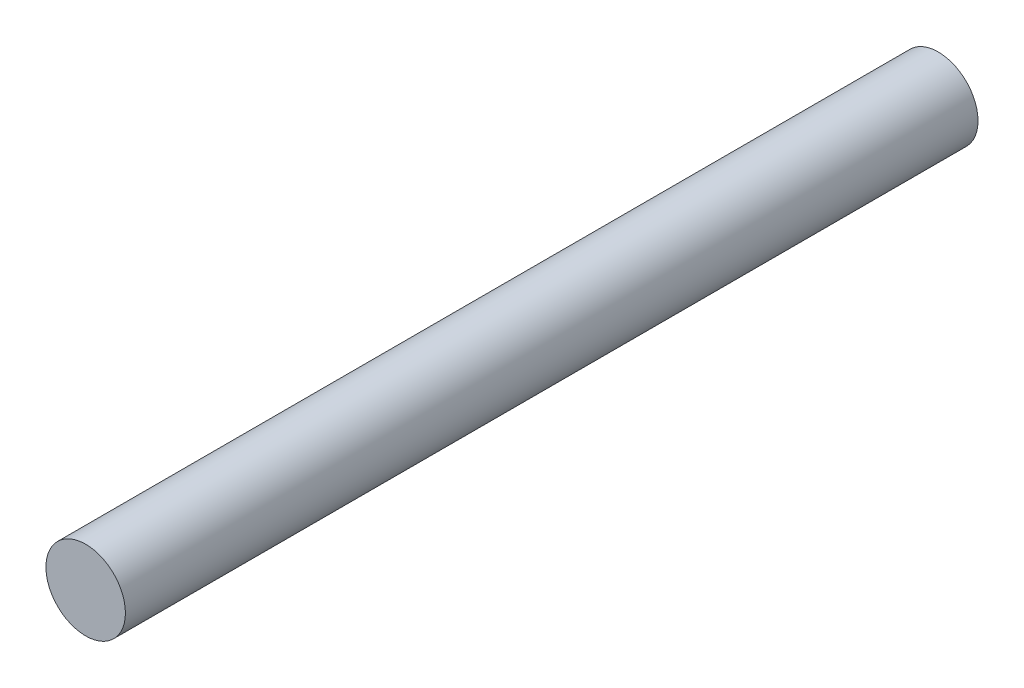
ISO-10303-21;
HEADER;
FILE_DESCRIPTION(('STEP AP214'),'2;1');
FILE_NAME('part.step','',(''),(''),'','','');
FILE_SCHEMA(('AUTOMOTIVE_DESIGN { 1 0 10303 214 1 1 1 1 }'));
ENDSEC;
DATA;
#1=APPLICATION_CONTEXT('core data for automotive mechanical design processes');
#2=APPLICATION_PROTOCOL_DEFINITION('international standard','automotive_design',2000,#1);
#3=PRODUCT_CONTEXT('',#1,'mechanical');
#4=PRODUCT('Part','Part','',(#3));
#5=PRODUCT_RELATED_PRODUCT_CATEGORY('part','',(#4));
#6=PRODUCT_DEFINITION_FORMATION('','',#4);
#7=PRODUCT_DEFINITION_CONTEXT('part definition',#1,'design');
#8=PRODUCT_DEFINITION('design','',#6,#7);
#9=PRODUCT_DEFINITION_SHAPE('','',#8);
#10=(LENGTH_UNIT() NAMED_UNIT(*) SI_UNIT(.MILLI.,.METRE.));
#11=(NAMED_UNIT(*) PLANE_ANGLE_UNIT() SI_UNIT($,.RADIAN.));
#12=(NAMED_UNIT(*) SI_UNIT($,.STERADIAN.) SOLID_ANGLE_UNIT());
#13=UNCERTAINTY_MEASURE_WITH_UNIT(LENGTH_MEASURE(1.E-05),#10,'distance_accuracy_value','');
#14=(GEOMETRIC_REPRESENTATION_CONTEXT(3) GLOBAL_UNCERTAINTY_ASSIGNED_CONTEXT((#13)) GLOBAL_UNIT_ASSIGNED_CONTEXT((#10,
#11,#12)) REPRESENTATION_CONTEXT('',''));
#15=CARTESIAN_POINT('',(0.,0.,0.));
#16=DIRECTION('',(0.,0.,1.));
#17=DIRECTION('',(1.,0.,0.));
#18=AXIS2_PLACEMENT_3D('',#15,#16,#17);
#19=CARTESIAN_POINT('',(0.,0.,-1812.8));
#20=DIRECTION('',(0.,0.,1.));
#21=DIRECTION('',(1.,0.,0.));
#22=AXIS2_PLACEMENT_3D('',#19,#20,#21);
#23=CYLINDRICAL_SURFACE('',#22,84.5);
#24=CARTESIAN_POINT('',(0.,0.,-1812.8));
#25=DIRECTION('',(0.,0.,1.));
#26=DIRECTION('',(1.,0.,0.));
#27=AXIS2_PLACEMENT_3D('',#24,#25,#26);
#28=CIRCLE('',#27,84.5);
#29=CARTESIAN_POINT('',(84.5,0.,-1812.8));
#30=VERTEX_POINT('',#29);
#31=EDGE_CURVE('E12',#30,#30,#28,.T.);
#32=ORIENTED_EDGE('',*,*,#31,.T.);
#33=EDGE_LOOP('',(#32));
#34=FACE_BOUND('',#33,.T.);
#35=CARTESIAN_POINT('',(0.,0.,0.));
#36=DIRECTION('',(0.,0.,1.));
#37=DIRECTION('',(1.,0.,0.));
#38=AXIS2_PLACEMENT_3D('',#35,#36,#37);
#39=CIRCLE('',#38,84.5);
#40=CARTESIAN_POINT('',(84.5,0.,0.));
#41=VERTEX_POINT('',#40);
#42=EDGE_CURVE('E43',#41,#41,#39,.T.);
#43=ORIENTED_EDGE('',*,*,#42,.F.);
#44=EDGE_LOOP('',(#43));
#45=FACE_BOUND('',#44,.T.);
#46=ADVANCED_FACE('F40',(#34,#45),#23,.T.);
#47=CARTESIAN_POINT('',(0.,0.,-1812.8));
#48=DIRECTION('',(0.,0.,1.));
#49=DIRECTION('',(1.,0.,0.));
#50=AXIS2_PLACEMENT_3D('',#47,#48,#49);
#51=PLANE('',#50);
#52=ORIENTED_EDGE('',*,*,#31,.F.);
#53=EDGE_LOOP('',(#52));
#54=FACE_BOUND('',#53,.T.);
#55=ADVANCED_FACE('F55',(#54),#51,.F.);
#56=CARTESIAN_POINT('',(0.,0.,0.));
#57=DIRECTION('',(0.,0.,1.));
#58=DIRECTION('',(1.,0.,0.));
#59=AXIS2_PLACEMENT_3D('',#56,#57,#58);
#60=PLANE('',#59);
#61=ORIENTED_EDGE('',*,*,#42,.T.);
#62=EDGE_LOOP('',(#61));
#63=FACE_BOUND('',#62,.T.);
#64=ADVANCED_FACE('F52',(#63),#60,.T.);
#65=CLOSED_SHELL('',(#46,#55,#64));
#66=MANIFOLD_SOLID_BREP('B2',#65);
#67=ADVANCED_BREP_SHAPE_REPRESENTATION('',(#18,#66),#14);
#68=SHAPE_DEFINITION_REPRESENTATION(#9,#67);
ENDSEC;
END-ISO-10303-21;
